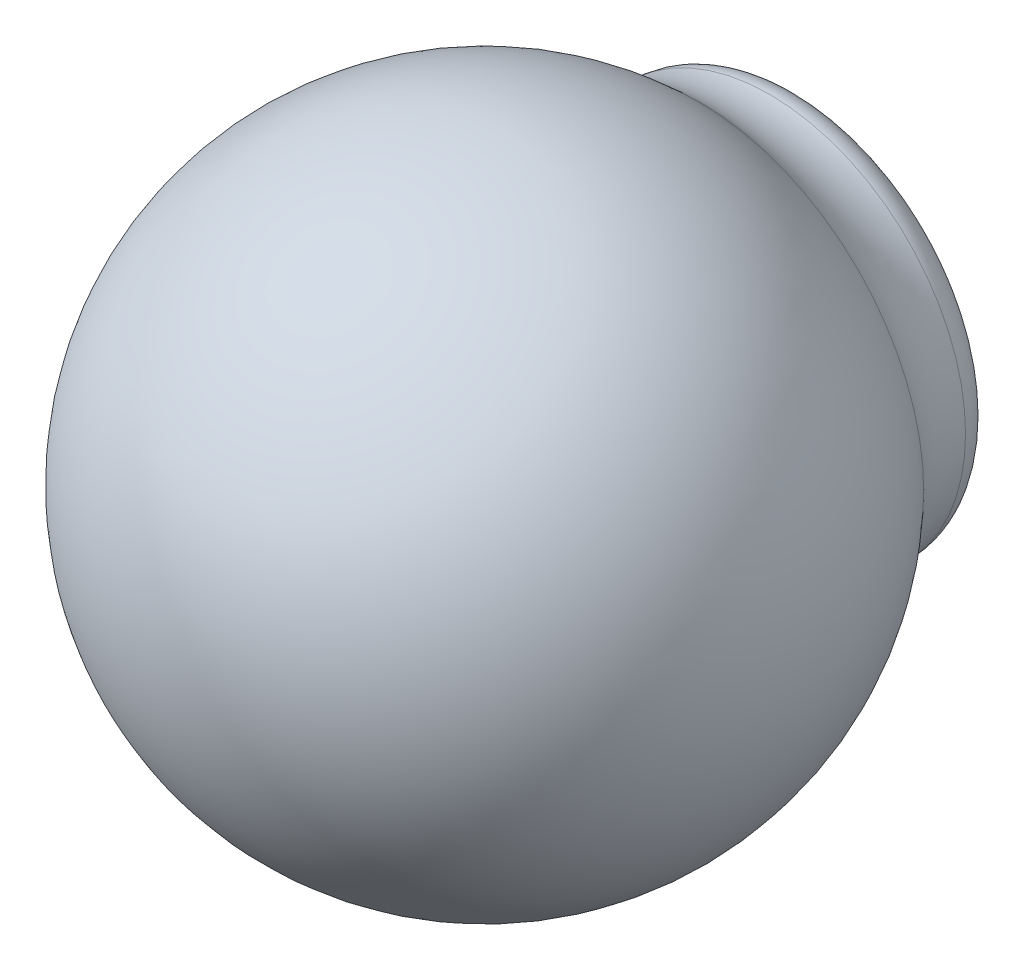
ISO-10303-21;
HEADER;
FILE_DESCRIPTION(('STEP AP214'),'2;1');
FILE_NAME('part.step','',(''),(''),'','','');
FILE_SCHEMA(('AUTOMOTIVE_DESIGN { 1 0 10303 214 1 1 1 1 }'));
ENDSEC;
DATA;
#1=APPLICATION_CONTEXT('core data for automotive mechanical design processes');
#2=APPLICATION_PROTOCOL_DEFINITION('international standard','automotive_design',2000,#1);
#3=PRODUCT_CONTEXT('',#1,'mechanical');
#4=PRODUCT('Part','Part','',(#3));
#5=PRODUCT_RELATED_PRODUCT_CATEGORY('part','',(#4));
#6=PRODUCT_DEFINITION_FORMATION('','',#4);
#7=PRODUCT_DEFINITION_CONTEXT('part definition',#1,'design');
#8=PRODUCT_DEFINITION('design','',#6,#7);
#9=PRODUCT_DEFINITION_SHAPE('','',#8);
#10=(LENGTH_UNIT() NAMED_UNIT(*) SI_UNIT(.MILLI.,.METRE.));
#11=(NAMED_UNIT(*) PLANE_ANGLE_UNIT() SI_UNIT($,.RADIAN.));
#12=(NAMED_UNIT(*) SI_UNIT($,.STERADIAN.) SOLID_ANGLE_UNIT());
#13=UNCERTAINTY_MEASURE_WITH_UNIT(LENGTH_MEASURE(1.E-05),#10,'distance_accuracy_value','');
#14=(GEOMETRIC_REPRESENTATION_CONTEXT(3) GLOBAL_UNCERTAINTY_ASSIGNED_CONTEXT((#13)) GLOBAL_UNIT_ASSIGNED_CONTEXT((#10,
#11,#12)) REPRESENTATION_CONTEXT('',''));
#15=CARTESIAN_POINT('',(0.,0.,0.));
#16=DIRECTION('',(0.,0.,1.));
#17=DIRECTION('',(1.,0.,0.));
#18=AXIS2_PLACEMENT_3D('',#15,#16,#17);
#19=CARTESIAN_POINT('',(0.,0.,30.5));
#20=DIRECTION('',(0.,-1.,0.));
#21=DIRECTION('',(1.,0.,0.));
#22=AXIS2_PLACEMENT_3D('',#19,#20,#21);
#23=SPHERICAL_SURFACE('',#22,30.);
#24=CARTESIAN_POINT('',(0.,0.,30.5));
#25=DIRECTION('',(0.,0.,1.));
#26=DIRECTION('',(1.,0.,0.));
#27=AXIS2_PLACEMENT_3D('',#24,#25,#26);
#28=SPHERICAL_SURFACE('',#27,30.);
#29=CARTESIAN_POINT('',(0.,0.,9.77522024267844));
#30=DIRECTION('',(0.,0.,1.));
#31=DIRECTION('',(1.,0.,0.));
#32=AXIS2_PLACEMENT_3D('',#29,#30,#31);
#33=CIRCLE('',#32,21.6906317107298);
#34=CARTESIAN_POINT('',(21.6906317107298,0.,9.77522024267844));
#35=VERTEX_POINT('',#34);
#36=EDGE_CURVE('E10',#35,#35,#33,.T.);
#37=ORIENTED_EDGE('',*,*,#36,.T.);
#38=EDGE_LOOP('',(#37));
#39=FACE_BOUND('',#38,.T.);
#40=ADVANCED_FACE('F33',(#39),#28,.T.);
#41=CARTESIAN_POINT('',(0.,0.,0.));
#42=DIRECTION('',(0.,0.,1.));
#43=DIRECTION('',(1.,0.,0.));
#44=AXIS2_PLACEMENT_3D('',#41,#42,#43);
#45=PLANE('',#44);
#46=CARTESIAN_POINT('',(0.,0.,0.));
#47=DIRECTION('',(0.,0.,-1.));
#48=DIRECTION('',(-1.,0.,0.));
#49=AXIS2_PLACEMENT_3D('',#46,#47,#48);
#50=CIRCLE('',#49,4.25);
#51=CARTESIAN_POINT('',(-4.25,0.,0.));
#52=VERTEX_POINT('',#51);
#53=EDGE_CURVE('E63',#52,#52,#50,.T.);
#54=ORIENTED_EDGE('',*,*,#53,.F.);
#55=EDGE_LOOP('',(#54));
#56=FACE_BOUND('',#55,.T.);
#57=CARTESIAN_POINT('',(0.,0.,0.));
#58=DIRECTION('',(0.,0.,1.));
#59=DIRECTION('',(1.,0.,0.));
#60=AXIS2_PLACEMENT_3D('',#57,#58,#59);
#61=CIRCLE('',#60,15.9215230509327);
#62=CARTESIAN_POINT('',(15.9215230509327,0.,0.));
#63=VERTEX_POINT('',#62);
#64=EDGE_CURVE('E44',#63,#63,#61,.F.);
#65=ORIENTED_EDGE('',*,*,#64,.T.);
#66=EDGE_LOOP('',(#65));
#67=FACE_BOUND('',#66,.T.);
#68=CARTESIAN_POINT('',(0.,11.2527767497326,0.));
#69=DIRECTION('',(0.,0.,1.));
#70=DIRECTION('',(1.,0.,0.));
#71=AXIS2_PLACEMENT_3D('',#68,#69,#70);
#72=CIRCLE('',#71,3.4);
#73=CARTESIAN_POINT('',(3.4,11.2527767497326,0.));
#74=VERTEX_POINT('',#73);
#75=EDGE_CURVE('E48',#74,#74,#72,.T.);
#76=ORIENTED_EDGE('',*,*,#75,.T.);
#77=EDGE_LOOP('',(#76));
#78=FACE_BOUND('',#77,.T.);
#79=CARTESIAN_POINT('',(6.35053196527873E-13,-11.2527767497326,0.));
#80=DIRECTION('',(0.,0.,1.));
#81=DIRECTION('',(1.,0.,0.));
#82=AXIS2_PLACEMENT_3D('',#79,#80,#81);
#83=CIRCLE('',#82,3.40000000000068);
#84=CARTESIAN_POINT('',(3.40000000000132,-11.2527767497326,0.));
#85=VERTEX_POINT('',#84);
#86=EDGE_CURVE('E53',#85,#85,#83,.T.);
#87=ORIENTED_EDGE('',*,*,#86,.T.);
#88=EDGE_LOOP('',(#87));
#89=FACE_BOUND('',#88,.T.);
#90=CARTESIAN_POINT('',(-11.2527767497323,-3.18675214718788E-13,0.));
#91=DIRECTION('',(0.,0.,1.));
#92=DIRECTION('',(1.,0.,0.));
#93=AXIS2_PLACEMENT_3D('',#90,#91,#92);
#94=CIRCLE('',#93,3.40000000000051);
#95=CARTESIAN_POINT('',(-7.85277674973174,-3.18675214718788E-13,0.));
#96=VERTEX_POINT('',#95);
#97=EDGE_CURVE('E56',#96,#96,#94,.T.);
#98=ORIENTED_EDGE('',*,*,#97,.T.);
#99=EDGE_LOOP('',(#98));
#100=FACE_BOUND('',#99,.T.);
#101=CARTESIAN_POINT('',(11.2527767497329,3.1729714701598E-13,0.));
#102=DIRECTION('',(0.,0.,1.));
#103=DIRECTION('',(1.,0.,0.));
#104=AXIS2_PLACEMENT_3D('',#101,#102,#103);
#105=CIRCLE('',#104,3.40000000000025);
#106=CARTESIAN_POINT('',(14.6527767497331,3.1729714701598E-13,0.));
#107=VERTEX_POINT('',#106);
#108=EDGE_CURVE('E59',#107,#107,#105,.T.);
#109=ORIENTED_EDGE('',*,*,#108,.T.);
#110=EDGE_LOOP('',(#109));
#111=FACE_BOUND('',#110,.T.);
#112=ADVANCED_FACE('F96',(#56,#67,#78,#89,#100,#111),#45,.F.);
#113=CARTESIAN_POINT('',(0.,11.2527767497326,10.));
#114=DIRECTION('',(0.,0.,-1.));
#115=DIRECTION('',(-1.,0.,0.));
#116=AXIS2_PLACEMENT_3D('',#113,#114,#115);
#117=CYLINDRICAL_SURFACE('',#116,3.4);
#118=ORIENTED_EDGE('',*,*,#75,.F.);
#119=EDGE_LOOP('',(#118));
#120=FACE_BOUND('',#119,.T.);
#121=CARTESIAN_POINT('',(0.,11.2527767497326,10.5));
#122=DIRECTION('',(0.,0.,-1.));
#123=DIRECTION('',(-1.,0.,0.));
#124=AXIS2_PLACEMENT_3D('',#121,#122,#123);
#125=CIRCLE('',#124,3.4);
#126=CARTESIAN_POINT('',(-3.4,11.2527767497326,10.5));
#127=VERTEX_POINT('',#126);
#128=EDGE_CURVE('E72',#127,#127,#125,.T.);
#129=ORIENTED_EDGE('',*,*,#128,.F.);
#130=EDGE_LOOP('',(#129));
#131=FACE_BOUND('',#130,.T.);
#132=ADVANCED_FACE('F86',(#120,#131),#117,.F.);
#133=CARTESIAN_POINT('',(6.35053196527873E-13,-11.2527767497326,10.));
#134=DIRECTION('',(0.,0.,-1.));
#135=DIRECTION('',(-1.,0.,0.));
#136=AXIS2_PLACEMENT_3D('',#133,#134,#135);
#137=CYLINDRICAL_SURFACE('',#136,3.40000000000068);
#138=ORIENTED_EDGE('',*,*,#86,.F.);
#139=EDGE_LOOP('',(#138));
#140=FACE_BOUND('',#139,.T.);
#141=CARTESIAN_POINT('',(6.35053196527873E-13,-11.2527767497326,10.5));
#142=DIRECTION('',(0.,0.,-1.));
#143=DIRECTION('',(-1.,0.,0.));
#144=AXIS2_PLACEMENT_3D('',#141,#142,#143);
#145=CIRCLE('',#144,3.40000000000068);
#146=CARTESIAN_POINT('',(-3.40000000000005,-11.2527767497326,10.5));
#147=VERTEX_POINT('',#146);
#148=EDGE_CURVE('E66',#147,#147,#145,.T.);
#149=ORIENTED_EDGE('',*,*,#148,.F.);
#150=EDGE_LOOP('',(#149));
#151=FACE_BOUND('',#150,.T.);
#152=ADVANCED_FACE('F83',(#140,#151),#137,.F.);
#153=CARTESIAN_POINT('',(-11.2527767497323,-3.18675214718788E-13,10.));
#154=DIRECTION('',(0.,0.,-1.));
#155=DIRECTION('',(-1.,0.,0.));
#156=AXIS2_PLACEMENT_3D('',#153,#154,#155);
#157=CYLINDRICAL_SURFACE('',#156,3.40000000000051);
#158=ORIENTED_EDGE('',*,*,#97,.F.);
#159=EDGE_LOOP('',(#158));
#160=FACE_BOUND('',#159,.T.);
#161=CARTESIAN_POINT('',(-11.2527767497323,-3.18675214718788E-13,10.5));
#162=DIRECTION('',(0.,0.,-1.));
#163=DIRECTION('',(-1.,0.,0.));
#164=AXIS2_PLACEMENT_3D('',#161,#162,#163);
#165=CIRCLE('',#164,3.40000000000051);
#166=CARTESIAN_POINT('',(-14.6527767497328,-3.18675214718788E-13,10.5));
#167=VERTEX_POINT('',#166);
#168=EDGE_CURVE('E69',#167,#167,#165,.T.);
#169=ORIENTED_EDGE('',*,*,#168,.F.);
#170=EDGE_LOOP('',(#169));
#171=FACE_BOUND('',#170,.T.);
#172=ADVANCED_FACE('F85',(#160,#171),#157,.F.);
#173=CARTESIAN_POINT('',(11.2527767497329,3.1729714701598E-13,10.));
#174=DIRECTION('',(0.,0.,-1.));
#175=DIRECTION('',(-1.,0.,0.));
#176=AXIS2_PLACEMENT_3D('',#173,#174,#175);
#177=CYLINDRICAL_SURFACE('',#176,3.40000000000025);
#178=ORIENTED_EDGE('',*,*,#108,.F.);
#179=EDGE_LOOP('',(#178));
#180=FACE_BOUND('',#179,.T.);
#181=CARTESIAN_POINT('',(11.2527767497329,3.1729714701598E-13,10.5));
#182=DIRECTION('',(0.,0.,-1.));
#183=DIRECTION('',(-1.,0.,0.));
#184=AXIS2_PLACEMENT_3D('',#181,#182,#183);
#185=CIRCLE('',#184,3.40000000000025);
#186=CARTESIAN_POINT('',(7.85277674973264,3.1729714701598E-13,10.5));
#187=VERTEX_POINT('',#186);
#188=EDGE_CURVE('E75',#187,#187,#185,.T.);
#189=ORIENTED_EDGE('',*,*,#188,.F.);
#190=EDGE_LOOP('',(#189));
#191=FACE_BOUND('',#190,.T.);
#192=ADVANCED_FACE('F93',(#180,#191),#177,.F.);
#193=CARTESIAN_POINT('',(0.,0.,3.));
#194=DIRECTION('',(0.,0.,1.));
#195=DIRECTION('',(1.,0.,0.));
#196=AXIS2_PLACEMENT_3D('',#193,#194,#195);
#197=TOROIDAL_SURFACE('',#196,15.9215230509327,3.);
#198=CARTESIAN_POINT('',(0.,0.,2.96929853620875));
#199=DIRECTION('',(0.,0.,1.));
#200=DIRECTION('',(1.,0.,0.));
#201=AXIS2_PLACEMENT_3D('',#198,#199,#200);
#202=CIRCLE('',#201,18.9213659501727);
#203=CARTESIAN_POINT('',(18.9213659501727,0.,2.96929853620875));
#204=VERTEX_POINT('',#203);
#205=EDGE_CURVE('E40',#204,#204,#202,.F.);
#206=ORIENTED_EDGE('',*,*,#205,.T.);
#207=EDGE_LOOP('',(#206));
#208=FACE_BOUND('',#207,.T.);
#209=ORIENTED_EDGE('',*,*,#64,.F.);
#210=EDGE_LOOP('',(#209));
#211=FACE_BOUND('',#210,.T.);
#212=ADVANCED_FACE('F112',(#208,#211),#197,.T.);
#213=CARTESIAN_POINT('',(0.,0.,40.));
#214=DIRECTION('',(0.,0.,-1.));
#215=DIRECTION('',(-1.,0.,0.));
#216=AXIS2_PLACEMENT_3D('',#213,#214,#215);
#217=CYLINDRICAL_SURFACE('',#216,4.25);
#218=CARTESIAN_POINT('',(0.,0.,40.));
#219=DIRECTION('',(0.,0.,-1.));
#220=DIRECTION('',(-1.,0.,0.));
#221=AXIS2_PLACEMENT_3D('',#218,#219,#220);
#222=CIRCLE('',#221,4.25);
#223=CARTESIAN_POINT('',(-4.25,0.,40.));
#224=VERTEX_POINT('',#223);
#225=EDGE_CURVE('E62',#224,#224,#222,.T.);
#226=ORIENTED_EDGE('',*,*,#225,.F.);
#227=EDGE_LOOP('',(#226));
#228=FACE_BOUND('',#227,.T.);
#229=ORIENTED_EDGE('',*,*,#53,.T.);
#230=EDGE_LOOP('',(#229));
#231=FACE_BOUND('',#230,.T.);
#232=ADVANCED_FACE('F109',(#228,#231),#217,.F.);
#233=CARTESIAN_POINT('',(0.,0.,40.));
#234=DIRECTION('',(0.,0.,-1.));
#235=DIRECTION('',(-1.,0.,0.));
#236=AXIS2_PLACEMENT_3D('',#233,#234,#235);
#237=PLANE('',#236);
#238=ORIENTED_EDGE('',*,*,#225,.T.);
#239=EDGE_LOOP('',(#238));
#240=FACE_BOUND('',#239,.T.);
#241=ADVANCED_FACE('F131',(#240),#237,.T.);
#242=CARTESIAN_POINT('',(0.,0.,2.86696032357126));
#243=DIRECTION('',(0.,0.,1.));
#244=DIRECTION('',(1.,0.,0.));
#245=AXIS2_PLACEMENT_3D('',#242,#243,#244);
#246=TOROIDAL_SURFACE('',#245,28.920842280973,10.);
#247=ORIENTED_EDGE('',*,*,#36,.F.);
#248=EDGE_LOOP('',(#247));
#249=FACE_BOUND('',#248,.T.);
#250=ORIENTED_EDGE('',*,*,#205,.F.);
#251=EDGE_LOOP('',(#250));
#252=FACE_BOUND('',#251,.T.);
#253=ADVANCED_FACE('F35',(#249,#252),#246,.F.);
#254=CARTESIAN_POINT('',(11.2527767497329,3.1729714701598E-13,10.5));
#255=DIRECTION('',(0.,0.,-1.));
#256=DIRECTION('',(-1.,0.,0.));
#257=AXIS2_PLACEMENT_3D('',#254,#255,#256);
#258=PLANE('',#257);
#259=ORIENTED_EDGE('',*,*,#188,.T.);
#260=EDGE_LOOP('',(#259));
#261=FACE_BOUND('',#260,.T.);
#262=ADVANCED_FACE('F121',(#261),#258,.T.);
#263=CARTESIAN_POINT('',(0.,11.2527767497326,10.5));
#264=DIRECTION('',(0.,0.,-1.));
#265=DIRECTION('',(-1.,0.,0.));
#266=AXIS2_PLACEMENT_3D('',#263,#264,#265);
#267=PLANE('',#266);
#268=ORIENTED_EDGE('',*,*,#128,.T.);
#269=EDGE_LOOP('',(#268));
#270=FACE_BOUND('',#269,.T.);
#271=ADVANCED_FACE('F123',(#270),#267,.T.);
#272=CARTESIAN_POINT('',(6.35053196527873E-13,-11.2527767497326,10.5));
#273=DIRECTION('',(0.,0.,-1.));
#274=DIRECTION('',(-1.,0.,0.));
#275=AXIS2_PLACEMENT_3D('',#272,#273,#274);
#276=PLANE('',#275);
#277=ORIENTED_EDGE('',*,*,#148,.T.);
#278=EDGE_LOOP('',(#277));
#279=FACE_BOUND('',#278,.T.);
#280=ADVANCED_FACE('F81',(#279),#276,.T.);
#281=CARTESIAN_POINT('',(-11.2527767497323,-3.18675214718788E-13,10.5));
#282=DIRECTION('',(0.,0.,-1.));
#283=DIRECTION('',(-1.,0.,0.));
#284=AXIS2_PLACEMENT_3D('',#281,#282,#283);
#285=PLANE('',#284);
#286=ORIENTED_EDGE('',*,*,#168,.T.);
#287=EDGE_LOOP('',(#286));
#288=FACE_BOUND('',#287,.T.);
#289=ADVANCED_FACE('F135',(#288),#285,.T.);
#290=CLOSED_SHELL('',(#40,#112,#132,#152,#172,#192,#212,#232,#241,#253,#262,#271,#280,#289));
#291=MANIFOLD_SOLID_BREP('B2',#290);
#292=ADVANCED_BREP_SHAPE_REPRESENTATION('',(#18,#291),#14);
#293=SHAPE_DEFINITION_REPRESENTATION(#9,#292);
ENDSEC;
END-ISO-10303-21;
